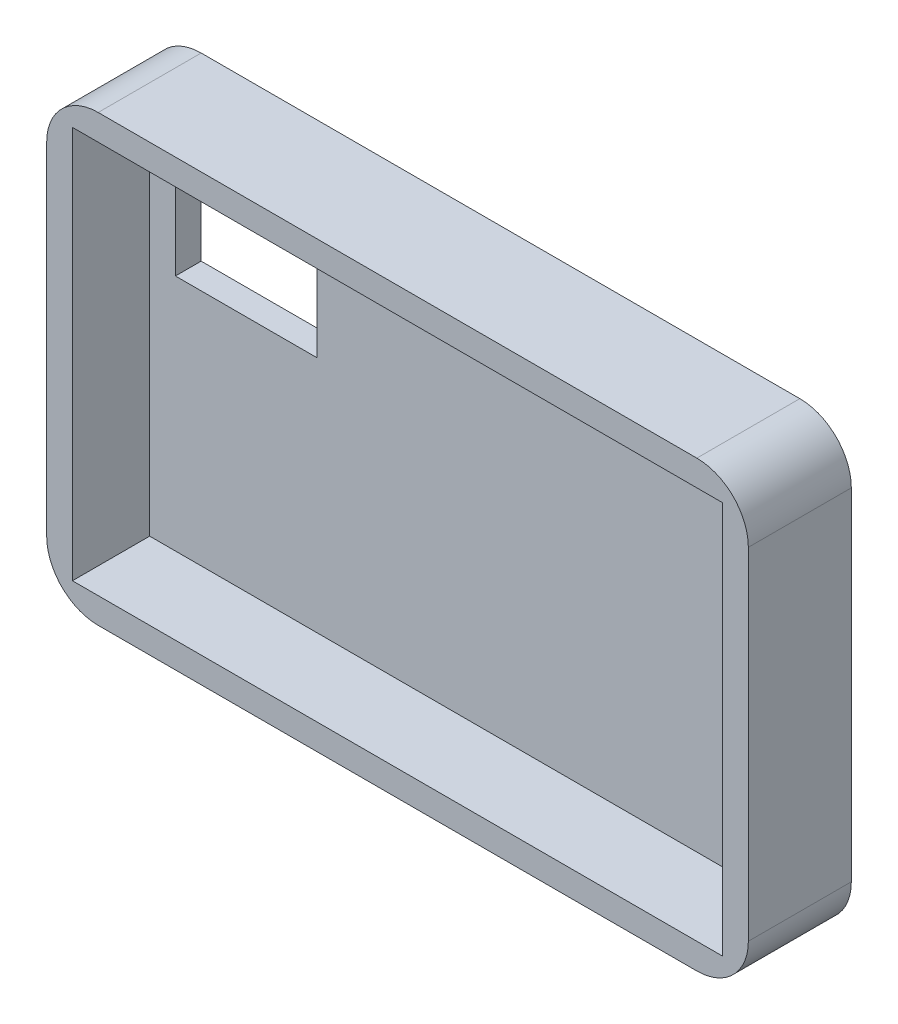
ISO-10303-21;
HEADER;
FILE_DESCRIPTION(('STEP AP214'),'2;1');
FILE_NAME('part.step','',(''),(''),'','','');
FILE_SCHEMA(('AUTOMOTIVE_DESIGN { 1 0 10303 214 1 1 1 1 }'));
ENDSEC;
DATA;
#1=APPLICATION_CONTEXT('core data for automotive mechanical design processes');
#2=APPLICATION_PROTOCOL_DEFINITION('international standard','automotive_design',2000,#1);
#3=PRODUCT_CONTEXT('',#1,'mechanical');
#4=PRODUCT('Part','Part','',(#3));
#5=PRODUCT_RELATED_PRODUCT_CATEGORY('part','',(#4));
#6=PRODUCT_DEFINITION_FORMATION('','',#4);
#7=PRODUCT_DEFINITION_CONTEXT('part definition',#1,'design');
#8=PRODUCT_DEFINITION('design','',#6,#7);
#9=PRODUCT_DEFINITION_SHAPE('','',#8);
#10=(LENGTH_UNIT() NAMED_UNIT(*) SI_UNIT(.MILLI.,.METRE.));
#11=(NAMED_UNIT(*) PLANE_ANGLE_UNIT() SI_UNIT($,.RADIAN.));
#12=(NAMED_UNIT(*) SI_UNIT($,.STERADIAN.) SOLID_ANGLE_UNIT());
#13=UNCERTAINTY_MEASURE_WITH_UNIT(LENGTH_MEASURE(1.E-05),#10,'distance_accuracy_value','');
#14=(GEOMETRIC_REPRESENTATION_CONTEXT(3) GLOBAL_UNCERTAINTY_ASSIGNED_CONTEXT((#13)) GLOBAL_UNIT_ASSIGNED_CONTEXT((#10,
#11,#12)) REPRESENTATION_CONTEXT('',''));
#15=CARTESIAN_POINT('',(0.,0.,0.));
#16=DIRECTION('',(0.,0.,1.));
#17=DIRECTION('',(1.,0.,0.));
#18=AXIS2_PLACEMENT_3D('',#15,#16,#17);
#19=CARTESIAN_POINT('',(27.25,17.25,8.));
#20=DIRECTION('',(-1.,0.,0.));
#21=DIRECTION('',(0.,-1.,0.));
#22=AXIS2_PLACEMENT_3D('',#19,#20,#21);
#23=PLANE('',#22);
#24=DIRECTION('',(0.,1.,0.));
#25=VECTOR('',#24,1.);
#26=CARTESIAN_POINT('',(27.25,17.25,8.));
#27=LINE('',#26,#25);
#28=CARTESIAN_POINT('',(27.25,-13.25,8.));
#29=VERTEX_POINT('',#28);
#30=CARTESIAN_POINT('',(27.25,13.25,8.));
#31=VERTEX_POINT('',#30);
#32=EDGE_CURVE('E207',#29,#31,#27,.T.);
#33=ORIENTED_EDGE('',*,*,#32,.F.);
#34=DIRECTION('',(0.,0.,-1.));
#35=VECTOR('',#34,1.);
#36=CARTESIAN_POINT('',(27.25,-13.25,8.));
#37=LINE('',#36,#35);
#38=CARTESIAN_POINT('',(27.25,-13.25,0.));
#39=VERTEX_POINT('',#38);
#40=EDGE_CURVE('E172',#29,#39,#37,.T.);
#41=ORIENTED_EDGE('',*,*,#40,.T.);
#42=DIRECTION('',(0.,1.,0.));
#43=VECTOR('',#42,1.);
#44=CARTESIAN_POINT('',(27.25,17.25,0.));
#45=LINE('',#44,#43);
#46=CARTESIAN_POINT('',(27.25,13.25,0.));
#47=VERTEX_POINT('',#46);
#48=EDGE_CURVE('E214',#39,#47,#45,.T.);
#49=ORIENTED_EDGE('',*,*,#48,.T.);
#50=DIRECTION('',(0.,0.,-1.));
#51=VECTOR('',#50,1.);
#52=CARTESIAN_POINT('',(27.25,13.25,8.));
#53=LINE('',#52,#51);
#54=EDGE_CURVE('E175',#47,#31,#53,.F.);
#55=ORIENTED_EDGE('',*,*,#54,.T.);
#56=EDGE_LOOP('',(#33,#41,#49,#55));
#57=FACE_BOUND('',#56,.T.);
#58=ADVANCED_FACE('F35',(#57),#23,.F.);
#59=CARTESIAN_POINT('',(-27.25,17.25,8.));
#60=DIRECTION('',(0.,-1.,0.));
#61=DIRECTION('',(0.,0.,-1.));
#62=AXIS2_PLACEMENT_3D('',#59,#60,#61);
#63=PLANE('',#62);
#64=DIRECTION('',(-1.,0.,0.));
#65=VECTOR('',#64,1.);
#66=CARTESIAN_POINT('',(-27.25,17.25,8.));
#67=LINE('',#66,#65);
#68=CARTESIAN_POINT('',(23.25,17.25,8.));
#69=VERTEX_POINT('',#68);
#70=CARTESIAN_POINT('',(-23.25,17.25,8.));
#71=VERTEX_POINT('',#70);
#72=EDGE_CURVE('E223',#69,#71,#67,.T.);
#73=ORIENTED_EDGE('',*,*,#72,.F.);
#74=DIRECTION('',(0.,0.,-1.));
#75=VECTOR('',#74,1.);
#76=CARTESIAN_POINT('',(23.25,17.25,8.));
#77=LINE('',#76,#75);
#78=CARTESIAN_POINT('',(23.25,17.25,0.));
#79=VERTEX_POINT('',#78);
#80=EDGE_CURVE('E150',#69,#79,#77,.T.);
#81=ORIENTED_EDGE('',*,*,#80,.T.);
#82=DIRECTION('',(-1.,0.,0.));
#83=VECTOR('',#82,1.);
#84=CARTESIAN_POINT('',(-27.25,17.25,0.));
#85=LINE('',#84,#83);
#86=CARTESIAN_POINT('',(-23.25,17.25,0.));
#87=VERTEX_POINT('',#86);
#88=EDGE_CURVE('E211',#79,#87,#85,.T.);
#89=ORIENTED_EDGE('',*,*,#88,.T.);
#90=DIRECTION('',(0.,0.,-1.));
#91=VECTOR('',#90,1.);
#92=CARTESIAN_POINT('',(-23.25,17.25,8.));
#93=LINE('',#92,#91);
#94=EDGE_CURVE('E170',#87,#71,#93,.F.);
#95=ORIENTED_EDGE('',*,*,#94,.T.);
#96=EDGE_LOOP('',(#73,#81,#89,#95));
#97=FACE_BOUND('',#96,.T.);
#98=ADVANCED_FACE('F285',(#97),#63,.F.);
#99=CARTESIAN_POINT('',(-27.25,17.25,8.));
#100=DIRECTION('',(1.,0.,0.));
#101=DIRECTION('',(0.,1.,0.));
#102=AXIS2_PLACEMENT_3D('',#99,#100,#101);
#103=PLANE('',#102);
#104=DIRECTION('',(0.,-1.,0.));
#105=VECTOR('',#104,1.);
#106=CARTESIAN_POINT('',(-27.25,17.25,0.));
#107=LINE('',#106,#105);
#108=CARTESIAN_POINT('',(-27.25,13.25,0.));
#109=VERTEX_POINT('',#108);
#110=CARTESIAN_POINT('',(-27.25,-13.25,0.));
#111=VERTEX_POINT('',#110);
#112=EDGE_CURVE('E208',#109,#111,#107,.T.);
#113=ORIENTED_EDGE('',*,*,#112,.T.);
#114=DIRECTION('',(0.,0.,-1.));
#115=VECTOR('',#114,1.);
#116=CARTESIAN_POINT('',(-27.25,-13.25,8.));
#117=LINE('',#116,#115);
#118=CARTESIAN_POINT('',(-27.25,-13.25,8.));
#119=VERTEX_POINT('',#118);
#120=EDGE_CURVE('E185',#111,#119,#117,.F.);
#121=ORIENTED_EDGE('',*,*,#120,.T.);
#122=DIRECTION('',(0.,-1.,0.));
#123=VECTOR('',#122,1.);
#124=CARTESIAN_POINT('',(-27.25,17.25,8.));
#125=LINE('',#124,#123);
#126=CARTESIAN_POINT('',(-27.25,13.25,8.));
#127=VERTEX_POINT('',#126);
#128=EDGE_CURVE('E220',#127,#119,#125,.T.);
#129=ORIENTED_EDGE('',*,*,#128,.F.);
#130=DIRECTION('',(0.,0.,-1.));
#131=VECTOR('',#130,1.);
#132=CARTESIAN_POINT('',(-27.25,13.25,8.));
#133=LINE('',#132,#131);
#134=EDGE_CURVE('E187',#127,#109,#133,.T.);
#135=ORIENTED_EDGE('',*,*,#134,.T.);
#136=EDGE_LOOP('',(#113,#121,#129,#135));
#137=FACE_BOUND('',#136,.T.);
#138=ADVANCED_FACE('F291',(#137),#103,.F.);
#139=CARTESIAN_POINT('',(-27.25,-17.25,8.));
#140=DIRECTION('',(0.,1.,0.));
#141=DIRECTION('',(0.,0.,1.));
#142=AXIS2_PLACEMENT_3D('',#139,#140,#141);
#143=PLANE('',#142);
#144=DIRECTION('',(1.,0.,0.));
#145=VECTOR('',#144,1.);
#146=CARTESIAN_POINT('',(-27.25,-17.25,8.));
#147=LINE('',#146,#145);
#148=CARTESIAN_POINT('',(-23.25,-17.25,8.));
#149=VERTEX_POINT('',#148);
#150=CARTESIAN_POINT('',(23.25,-17.25,8.));
#151=VERTEX_POINT('',#150);
#152=EDGE_CURVE('E203',#149,#151,#147,.T.);
#153=ORIENTED_EDGE('',*,*,#152,.F.);
#154=DIRECTION('',(0.,0.,-1.));
#155=VECTOR('',#154,1.);
#156=CARTESIAN_POINT('',(-23.25,-17.25,8.));
#157=LINE('',#156,#155);
#158=CARTESIAN_POINT('',(-23.25,-17.25,0.));
#159=VERTEX_POINT('',#158);
#160=EDGE_CURVE('E198',#149,#159,#157,.T.);
#161=ORIENTED_EDGE('',*,*,#160,.T.);
#162=DIRECTION('',(1.,0.,0.));
#163=VECTOR('',#162,1.);
#164=CARTESIAN_POINT('',(-27.25,-17.25,0.));
#165=LINE('',#164,#163);
#166=CARTESIAN_POINT('',(23.25,-17.25,0.));
#167=VERTEX_POINT('',#166);
#168=EDGE_CURVE('E204',#159,#167,#165,.T.);
#169=ORIENTED_EDGE('',*,*,#168,.T.);
#170=DIRECTION('',(0.,0.,-1.));
#171=VECTOR('',#170,1.);
#172=CARTESIAN_POINT('',(23.25,-17.25,8.));
#173=LINE('',#172,#171);
#174=EDGE_CURVE('E201',#167,#151,#173,.F.);
#175=ORIENTED_EDGE('',*,*,#174,.T.);
#176=EDGE_LOOP('',(#153,#161,#169,#175));
#177=FACE_BOUND('',#176,.T.);
#178=ADVANCED_FACE('F330',(#177),#143,.F.);
#179=CARTESIAN_POINT('',(0.,0.,8.));
#180=DIRECTION('',(0.,0.,1.));
#181=DIRECTION('',(1.,0.,0.));
#182=AXIS2_PLACEMENT_3D('',#179,#180,#181);
#183=PLANE('',#182);
#184=DIRECTION('',(0.,1.,0.));
#185=VECTOR('',#184,1.);
#186=CARTESIAN_POINT('',(25.25,17.25,8.));
#187=LINE('',#186,#185);
#188=CARTESIAN_POINT('',(25.25,-15.25,8.));
#189=VERTEX_POINT('',#188);
#190=CARTESIAN_POINT('',(25.25,15.25,8.));
#191=VERTEX_POINT('',#190);
#192=EDGE_CURVE('E236',#189,#191,#187,.T.);
#193=ORIENTED_EDGE('',*,*,#192,.F.);
#194=DIRECTION('',(1.,0.,0.));
#195=VECTOR('',#194,1.);
#196=CARTESIAN_POINT('',(-27.25,-15.25,8.));
#197=LINE('',#196,#195);
#198=CARTESIAN_POINT('',(-25.25,-15.25,8.));
#199=VERTEX_POINT('',#198);
#200=EDGE_CURVE('E228',#199,#189,#197,.T.);
#201=ORIENTED_EDGE('',*,*,#200,.F.);
#202=DIRECTION('',(0.,-1.,0.));
#203=VECTOR('',#202,1.);
#204=CARTESIAN_POINT('',(-25.25,17.25,8.));
#205=LINE('',#204,#203);
#206=CARTESIAN_POINT('',(-25.25,15.25,8.));
#207=VERTEX_POINT('',#206);
#208=EDGE_CURVE('E231',#207,#199,#205,.T.);
#209=ORIENTED_EDGE('',*,*,#208,.F.);
#210=DIRECTION('',(-1.,0.,0.));
#211=VECTOR('',#210,1.);
#212=CARTESIAN_POINT('',(-27.25,15.25,8.));
#213=LINE('',#212,#211);
#214=EDGE_CURVE('E234',#191,#207,#213,.T.);
#215=ORIENTED_EDGE('',*,*,#214,.F.);
#216=EDGE_LOOP('',(#193,#201,#209,#215));
#217=FACE_BOUND('',#216,.T.);
#218=ORIENTED_EDGE('',*,*,#128,.T.);
#219=CARTESIAN_POINT('',(-23.25,-13.25,8.));
#220=DIRECTION('',(0.,0.,1.));
#221=DIRECTION('',(1.,0.,0.));
#222=AXIS2_PLACEMENT_3D('',#219,#220,#221);
#223=CIRCLE('',#222,4.);
#224=EDGE_CURVE('E177',#119,#149,#223,.T.);
#225=ORIENTED_EDGE('',*,*,#224,.T.);
#226=ORIENTED_EDGE('',*,*,#152,.T.);
#227=CARTESIAN_POINT('',(23.25,-13.25,8.));
#228=DIRECTION('',(0.,0.,1.));
#229=DIRECTION('',(1.,0.,0.));
#230=AXIS2_PLACEMENT_3D('',#227,#228,#229);
#231=CIRCLE('',#230,4.);
#232=EDGE_CURVE('E179',#151,#29,#231,.T.);
#233=ORIENTED_EDGE('',*,*,#232,.T.);
#234=ORIENTED_EDGE('',*,*,#32,.T.);
#235=CARTESIAN_POINT('',(23.25,13.25,8.));
#236=DIRECTION('',(0.,0.,1.));
#237=DIRECTION('',(1.,0.,0.));
#238=AXIS2_PLACEMENT_3D('',#235,#236,#237);
#239=CIRCLE('',#238,4.);
#240=EDGE_CURVE('E181',#31,#69,#239,.T.);
#241=ORIENTED_EDGE('',*,*,#240,.T.);
#242=ORIENTED_EDGE('',*,*,#72,.T.);
#243=CARTESIAN_POINT('',(-23.25,13.25,8.));
#244=DIRECTION('',(0.,0.,1.));
#245=DIRECTION('',(1.,0.,0.));
#246=AXIS2_PLACEMENT_3D('',#243,#244,#245);
#247=CIRCLE('',#246,4.);
#248=EDGE_CURVE('E183',#71,#127,#247,.T.);
#249=ORIENTED_EDGE('',*,*,#248,.T.);
#250=EDGE_LOOP('',(#218,#225,#226,#233,#234,#241,#242,#249));
#251=FACE_BOUND('',#250,.T.);
#252=ADVANCED_FACE('F316',(#217,#251),#183,.T.);
#253=CARTESIAN_POINT('',(0.,0.,0.));
#254=DIRECTION('',(0.,0.,1.));
#255=DIRECTION('',(1.,0.,0.));
#256=AXIS2_PLACEMENT_3D('',#253,#254,#255);
#257=PLANE('',#256);
#258=DIRECTION('',(-1.,0.,0.));
#259=VECTOR('',#258,1.);
#260=CARTESIAN_POINT('',(0.,14.25,0.));
#261=LINE('',#260,#259);
#262=CARTESIAN_POINT('',(-12.25,14.25,0.));
#263=VERTEX_POINT('',#262);
#264=CARTESIAN_POINT('',(-23.25,14.25,0.));
#265=VERTEX_POINT('',#264);
#266=EDGE_CURVE('E264',#263,#265,#261,.T.);
#267=ORIENTED_EDGE('',*,*,#266,.T.);
#268=DIRECTION('',(0.,-1.,0.));
#269=VECTOR('',#268,1.);
#270=CARTESIAN_POINT('',(-23.25,0.,0.));
#271=LINE('',#270,#269);
#272=CARTESIAN_POINT('',(-23.25,3.25000000000001,0.));
#273=VERTEX_POINT('',#272);
#274=EDGE_CURVE('E157',#265,#273,#271,.T.);
#275=ORIENTED_EDGE('',*,*,#274,.T.);
#276=DIRECTION('',(1.,0.,0.));
#277=VECTOR('',#276,1.);
#278=CARTESIAN_POINT('',(0.,3.25000000000001,0.));
#279=LINE('',#278,#277);
#280=CARTESIAN_POINT('',(-12.25,3.25000000000001,0.));
#281=VERTEX_POINT('',#280);
#282=EDGE_CURVE('E258',#273,#281,#279,.T.);
#283=ORIENTED_EDGE('',*,*,#282,.T.);
#284=DIRECTION('',(0.,1.,0.));
#285=VECTOR('',#284,1.);
#286=CARTESIAN_POINT('',(-12.25,0.,0.));
#287=LINE('',#286,#285);
#288=EDGE_CURVE('E261',#281,#263,#287,.T.);
#289=ORIENTED_EDGE('',*,*,#288,.T.);
#290=EDGE_LOOP('',(#267,#275,#283,#289));
#291=FACE_BOUND('',#290,.T.);
#292=ORIENTED_EDGE('',*,*,#168,.F.);
#293=CARTESIAN_POINT('',(-23.25,-13.25,0.));
#294=DIRECTION('',(0.,0.,1.));
#295=DIRECTION('',(1.,0.,0.));
#296=AXIS2_PLACEMENT_3D('',#293,#294,#295);
#297=CIRCLE('',#296,4.);
#298=EDGE_CURVE('E190',#159,#111,#297,.F.);
#299=ORIENTED_EDGE('',*,*,#298,.T.);
#300=ORIENTED_EDGE('',*,*,#112,.F.);
#301=CARTESIAN_POINT('',(-23.25,13.25,0.));
#302=DIRECTION('',(0.,0.,1.));
#303=DIRECTION('',(1.,0.,0.));
#304=AXIS2_PLACEMENT_3D('',#301,#302,#303);
#305=CIRCLE('',#304,4.);
#306=EDGE_CURVE('E196',#109,#87,#305,.F.);
#307=ORIENTED_EDGE('',*,*,#306,.T.);
#308=ORIENTED_EDGE('',*,*,#88,.F.);
#309=CARTESIAN_POINT('',(23.25,13.25,0.));
#310=DIRECTION('',(0.,0.,1.));
#311=DIRECTION('',(1.,0.,0.));
#312=AXIS2_PLACEMENT_3D('',#309,#310,#311);
#313=CIRCLE('',#312,4.);
#314=EDGE_CURVE('E194',#79,#47,#313,.F.);
#315=ORIENTED_EDGE('',*,*,#314,.T.);
#316=ORIENTED_EDGE('',*,*,#48,.F.);
#317=CARTESIAN_POINT('',(23.25,-13.25,0.));
#318=DIRECTION('',(0.,0.,1.));
#319=DIRECTION('',(1.,0.,0.));
#320=AXIS2_PLACEMENT_3D('',#317,#318,#319);
#321=CIRCLE('',#320,4.);
#322=EDGE_CURVE('E192',#39,#167,#321,.F.);
#323=ORIENTED_EDGE('',*,*,#322,.T.);
#324=EDGE_LOOP('',(#292,#299,#300,#307,#308,#315,#316,#323));
#325=FACE_BOUND('',#324,.T.);
#326=ADVANCED_FACE('F271',(#291,#325),#257,.F.);
#327=CARTESIAN_POINT('',(25.25,17.25,8.));
#328=DIRECTION('',(-1.,0.,0.));
#329=DIRECTION('',(0.,-1.,0.));
#330=AXIS2_PLACEMENT_3D('',#327,#328,#329);
#331=PLANE('',#330);
#332=DIRECTION('',(0.,1.,0.));
#333=VECTOR('',#332,1.);
#334=CARTESIAN_POINT('',(25.25,17.25,2.));
#335=LINE('',#334,#333);
#336=CARTESIAN_POINT('',(25.25,-15.25,2.));
#337=VERTEX_POINT('',#336);
#338=CARTESIAN_POINT('',(25.25,15.25,2.));
#339=VERTEX_POINT('',#338);
#340=EDGE_CURVE('E250',#337,#339,#335,.T.);
#341=ORIENTED_EDGE('',*,*,#340,.F.);
#342=DIRECTION('',(0.,0.,-1.));
#343=VECTOR('',#342,1.);
#344=CARTESIAN_POINT('',(25.25,-15.25,8.));
#345=LINE('',#344,#343);
#346=EDGE_CURVE('E230',#189,#337,#345,.T.);
#347=ORIENTED_EDGE('',*,*,#346,.F.);
#348=ORIENTED_EDGE('',*,*,#192,.T.);
#349=DIRECTION('',(0.,0.,-1.));
#350=VECTOR('',#349,1.);
#351=CARTESIAN_POINT('',(25.25,15.25,8.));
#352=LINE('',#351,#350);
#353=EDGE_CURVE('E217',#191,#339,#352,.T.);
#354=ORIENTED_EDGE('',*,*,#353,.T.);
#355=EDGE_LOOP('',(#341,#347,#348,#354));
#356=FACE_BOUND('',#355,.T.);
#357=ADVANCED_FACE('F336',(#356),#331,.T.);
#358=CARTESIAN_POINT('',(-27.25,15.25,8.));
#359=DIRECTION('',(0.,-1.,0.));
#360=DIRECTION('',(0.,0.,-1.));
#361=AXIS2_PLACEMENT_3D('',#358,#359,#360);
#362=PLANE('',#361);
#363=DIRECTION('',(-1.,0.,0.));
#364=VECTOR('',#363,1.);
#365=CARTESIAN_POINT('',(-27.25,15.25,2.));
#366=LINE('',#365,#364);
#367=CARTESIAN_POINT('',(-25.25,15.25,2.));
#368=VERTEX_POINT('',#367);
#369=EDGE_CURVE('E246',#339,#368,#366,.T.);
#370=ORIENTED_EDGE('',*,*,#369,.F.);
#371=ORIENTED_EDGE('',*,*,#353,.F.);
#372=ORIENTED_EDGE('',*,*,#214,.T.);
#373=DIRECTION('',(0.,0.,-1.));
#374=VECTOR('',#373,1.);
#375=CARTESIAN_POINT('',(-25.25,15.25,8.));
#376=LINE('',#375,#374);
#377=EDGE_CURVE('E244',#207,#368,#376,.T.);
#378=ORIENTED_EDGE('',*,*,#377,.T.);
#379=EDGE_LOOP('',(#370,#371,#372,#378));
#380=FACE_BOUND('',#379,.T.);
#381=ADVANCED_FACE('F342',(#380),#362,.T.);
#382=CARTESIAN_POINT('',(-25.25,17.25,8.));
#383=DIRECTION('',(1.,0.,0.));
#384=DIRECTION('',(0.,1.,0.));
#385=AXIS2_PLACEMENT_3D('',#382,#383,#384);
#386=PLANE('',#385);
#387=DIRECTION('',(0.,-1.,0.));
#388=VECTOR('',#387,1.);
#389=CARTESIAN_POINT('',(-25.25,17.25,2.));
#390=LINE('',#389,#388);
#391=CARTESIAN_POINT('',(-25.25,-15.25,2.));
#392=VERTEX_POINT('',#391);
#393=EDGE_CURVE('E240',#368,#392,#390,.T.);
#394=ORIENTED_EDGE('',*,*,#393,.F.);
#395=ORIENTED_EDGE('',*,*,#377,.F.);
#396=ORIENTED_EDGE('',*,*,#208,.T.);
#397=DIRECTION('',(0.,0.,-1.));
#398=VECTOR('',#397,1.);
#399=CARTESIAN_POINT('',(-25.25,-15.25,8.));
#400=LINE('',#399,#398);
#401=EDGE_CURVE('E241',#199,#392,#400,.T.);
#402=ORIENTED_EDGE('',*,*,#401,.T.);
#403=EDGE_LOOP('',(#394,#395,#396,#402));
#404=FACE_BOUND('',#403,.T.);
#405=ADVANCED_FACE('F431',(#404),#386,.T.);
#406=CARTESIAN_POINT('',(-27.25,-15.25,8.));
#407=DIRECTION('',(0.,1.,0.));
#408=DIRECTION('',(0.,0.,1.));
#409=AXIS2_PLACEMENT_3D('',#406,#407,#408);
#410=PLANE('',#409);
#411=DIRECTION('',(1.,0.,0.));
#412=VECTOR('',#411,1.);
#413=CARTESIAN_POINT('',(-27.25,-15.25,2.));
#414=LINE('',#413,#412);
#415=EDGE_CURVE('E238',#392,#337,#414,.T.);
#416=ORIENTED_EDGE('',*,*,#415,.F.);
#417=ORIENTED_EDGE('',*,*,#401,.F.);
#418=ORIENTED_EDGE('',*,*,#200,.T.);
#419=ORIENTED_EDGE('',*,*,#346,.T.);
#420=EDGE_LOOP('',(#416,#417,#418,#419));
#421=FACE_BOUND('',#420,.T.);
#422=ADVANCED_FACE('F400',(#421),#410,.T.);
#423=CARTESIAN_POINT('',(0.,0.,2.));
#424=DIRECTION('',(0.,0.,1.));
#425=DIRECTION('',(1.,0.,0.));
#426=AXIS2_PLACEMENT_3D('',#423,#424,#425);
#427=PLANE('',#426);
#428=DIRECTION('',(0.,-1.,0.));
#429=VECTOR('',#428,1.);
#430=CARTESIAN_POINT('',(-23.25,0.,2.));
#431=LINE('',#430,#429);
#432=CARTESIAN_POINT('',(-23.25,14.25,2.));
#433=VERTEX_POINT('',#432);
#434=CARTESIAN_POINT('',(-23.25,3.25000000000001,2.));
#435=VERTEX_POINT('',#434);
#436=EDGE_CURVE('E11',#433,#435,#431,.T.);
#437=ORIENTED_EDGE('',*,*,#436,.F.);
#438=DIRECTION('',(-1.,0.,0.));
#439=VECTOR('',#438,1.);
#440=CARTESIAN_POINT('',(0.,14.25,2.));
#441=LINE('',#440,#439);
#442=CARTESIAN_POINT('',(-12.25,14.25,2.));
#443=VERTEX_POINT('',#442);
#444=EDGE_CURVE('E144',#443,#433,#441,.T.);
#445=ORIENTED_EDGE('',*,*,#444,.F.);
#446=DIRECTION('',(0.,1.,0.));
#447=VECTOR('',#446,1.);
#448=CARTESIAN_POINT('',(-12.25,0.,2.));
#449=LINE('',#448,#447);
#450=CARTESIAN_POINT('',(-12.25,3.25000000000001,2.));
#451=VERTEX_POINT('',#450);
#452=EDGE_CURVE('E149',#451,#443,#449,.T.);
#453=ORIENTED_EDGE('',*,*,#452,.F.);
#454=DIRECTION('',(1.,0.,0.));
#455=VECTOR('',#454,1.);
#456=CARTESIAN_POINT('',(0.,3.25000000000001,2.));
#457=LINE('',#456,#455);
#458=EDGE_CURVE('E43',#435,#451,#457,.T.);
#459=ORIENTED_EDGE('',*,*,#458,.F.);
#460=EDGE_LOOP('',(#437,#445,#453,#459));
#461=FACE_BOUND('',#460,.T.);
#462=ORIENTED_EDGE('',*,*,#340,.T.);
#463=ORIENTED_EDGE('',*,*,#369,.T.);
#464=ORIENTED_EDGE('',*,*,#393,.T.);
#465=ORIENTED_EDGE('',*,*,#415,.T.);
#466=EDGE_LOOP('',(#462,#463,#464,#465));
#467=FACE_BOUND('',#466,.T.);
#468=ADVANCED_FACE('F161',(#461,#467),#427,.T.);
#469=CARTESIAN_POINT('',(-23.25,-13.25,8.));
#470=DIRECTION('',(0.,0.,-1.));
#471=DIRECTION('',(-1.,0.,0.));
#472=AXIS2_PLACEMENT_3D('',#469,#470,#471);
#473=CYLINDRICAL_SURFACE('',#472,4.);
#474=ORIENTED_EDGE('',*,*,#224,.F.);
#475=ORIENTED_EDGE('',*,*,#120,.F.);
#476=ORIENTED_EDGE('',*,*,#298,.F.);
#477=ORIENTED_EDGE('',*,*,#160,.F.);
#478=EDGE_LOOP('',(#474,#475,#476,#477));
#479=FACE_BOUND('',#478,.T.);
#480=ADVANCED_FACE('F297',(#479),#473,.T.);
#481=CARTESIAN_POINT('',(23.25,-13.25,8.));
#482=DIRECTION('',(0.,0.,-1.));
#483=DIRECTION('',(-1.,0.,0.));
#484=AXIS2_PLACEMENT_3D('',#481,#482,#483);
#485=CYLINDRICAL_SURFACE('',#484,4.);
#486=ORIENTED_EDGE('',*,*,#232,.F.);
#487=ORIENTED_EDGE('',*,*,#174,.F.);
#488=ORIENTED_EDGE('',*,*,#322,.F.);
#489=ORIENTED_EDGE('',*,*,#40,.F.);
#490=EDGE_LOOP('',(#486,#487,#488,#489));
#491=FACE_BOUND('',#490,.T.);
#492=ADVANCED_FACE('F300',(#491),#485,.T.);
#493=CARTESIAN_POINT('',(23.25,13.25,8.));
#494=DIRECTION('',(0.,0.,-1.));
#495=DIRECTION('',(-1.,0.,0.));
#496=AXIS2_PLACEMENT_3D('',#493,#494,#495);
#497=CYLINDRICAL_SURFACE('',#496,4.);
#498=ORIENTED_EDGE('',*,*,#240,.F.);
#499=ORIENTED_EDGE('',*,*,#54,.F.);
#500=ORIENTED_EDGE('',*,*,#314,.F.);
#501=ORIENTED_EDGE('',*,*,#80,.F.);
#502=EDGE_LOOP('',(#498,#499,#500,#501));
#503=FACE_BOUND('',#502,.T.);
#504=ADVANCED_FACE('F303',(#503),#497,.T.);
#505=CARTESIAN_POINT('',(-23.25,13.25,8.));
#506=DIRECTION('',(0.,0.,-1.));
#507=DIRECTION('',(-1.,0.,0.));
#508=AXIS2_PLACEMENT_3D('',#505,#506,#507);
#509=CYLINDRICAL_SURFACE('',#508,4.);
#510=ORIENTED_EDGE('',*,*,#248,.F.);
#511=ORIENTED_EDGE('',*,*,#94,.F.);
#512=ORIENTED_EDGE('',*,*,#306,.F.);
#513=ORIENTED_EDGE('',*,*,#134,.F.);
#514=EDGE_LOOP('',(#510,#511,#512,#513));
#515=FACE_BOUND('',#514,.T.);
#516=ADVANCED_FACE('F37',(#515),#509,.T.);
#517=CARTESIAN_POINT('',(-23.25,14.25,16.));
#518=DIRECTION('',(-1.,0.,0.));
#519=DIRECTION('',(0.,0.,1.));
#520=AXIS2_PLACEMENT_3D('',#517,#518,#519);
#521=PLANE('',#520);
#522=DIRECTION('',(0.,0.,-1.));
#523=VECTOR('',#522,1.);
#524=CARTESIAN_POINT('',(-23.25,14.25,16.));
#525=LINE('',#524,#523);
#526=EDGE_CURVE('E50',#433,#265,#525,.T.);
#527=ORIENTED_EDGE('',*,*,#526,.F.);
#528=ORIENTED_EDGE('',*,*,#436,.T.);
#529=DIRECTION('',(0.,0.,-1.));
#530=VECTOR('',#529,1.);
#531=CARTESIAN_POINT('',(-23.25,3.25000000000001,16.));
#532=LINE('',#531,#530);
#533=EDGE_CURVE('E265',#435,#273,#532,.T.);
#534=ORIENTED_EDGE('',*,*,#533,.T.);
#535=ORIENTED_EDGE('',*,*,#274,.F.);
#536=EDGE_LOOP('',(#527,#528,#534,#535));
#537=FACE_BOUND('',#536,.T.);
#538=ADVANCED_FACE('F153',(#537),#521,.F.);
#539=CARTESIAN_POINT('',(-12.25,3.25000000000001,16.));
#540=DIRECTION('',(0.,-1.,0.));
#541=DIRECTION('',(1.,0.,0.));
#542=AXIS2_PLACEMENT_3D('',#539,#540,#541);
#543=PLANE('',#542);
#544=ORIENTED_EDGE('',*,*,#533,.F.);
#545=ORIENTED_EDGE('',*,*,#458,.T.);
#546=DIRECTION('',(0.,0.,-1.));
#547=VECTOR('',#546,1.);
#548=CARTESIAN_POINT('',(-12.25,3.25000000000001,16.));
#549=LINE('',#548,#547);
#550=EDGE_CURVE('E268',#451,#281,#549,.T.);
#551=ORIENTED_EDGE('',*,*,#550,.T.);
#552=ORIENTED_EDGE('',*,*,#282,.F.);
#553=EDGE_LOOP('',(#544,#545,#551,#552));
#554=FACE_BOUND('',#553,.T.);
#555=ADVANCED_FACE('F275',(#554),#543,.F.);
#556=CARTESIAN_POINT('',(-12.25,14.25,16.));
#557=DIRECTION('',(1.,0.,0.));
#558=DIRECTION('',(0.,0.,-1.));
#559=AXIS2_PLACEMENT_3D('',#556,#557,#558);
#560=PLANE('',#559);
#561=ORIENTED_EDGE('',*,*,#550,.F.);
#562=ORIENTED_EDGE('',*,*,#452,.T.);
#563=DIRECTION('',(0.,0.,-1.));
#564=VECTOR('',#563,1.);
#565=CARTESIAN_POINT('',(-12.25,14.25,16.));
#566=LINE('',#565,#564);
#567=EDGE_CURVE('E55',#443,#263,#566,.T.);
#568=ORIENTED_EDGE('',*,*,#567,.T.);
#569=ORIENTED_EDGE('',*,*,#288,.F.);
#570=EDGE_LOOP('',(#561,#562,#568,#569));
#571=FACE_BOUND('',#570,.T.);
#572=ADVANCED_FACE('F274',(#571),#560,.F.);
#573=CARTESIAN_POINT('',(-12.25,14.25,16.));
#574=DIRECTION('',(0.,1.,0.));
#575=DIRECTION('',(0.,0.,1.));
#576=AXIS2_PLACEMENT_3D('',#573,#574,#575);
#577=PLANE('',#576);
#578=ORIENTED_EDGE('',*,*,#567,.F.);
#579=ORIENTED_EDGE('',*,*,#444,.T.);
#580=ORIENTED_EDGE('',*,*,#526,.T.);
#581=ORIENTED_EDGE('',*,*,#266,.F.);
#582=EDGE_LOOP('',(#578,#579,#580,#581));
#583=FACE_BOUND('',#582,.T.);
#584=ADVANCED_FACE('F145',(#583),#577,.F.);
#585=CLOSED_SHELL('',(#58,#98,#138,#178,#252,#326,#357,#381,#405,#422,#468,#480,#492,#504,#516,
#538,#555,#572,#584));
#586=MANIFOLD_SOLID_BREP('B2',#585);
#587=ADVANCED_BREP_SHAPE_REPRESENTATION('',(#18,#586),#14);
#588=SHAPE_DEFINITION_REPRESENTATION(#9,#587);
ENDSEC;
END-ISO-10303-21;
